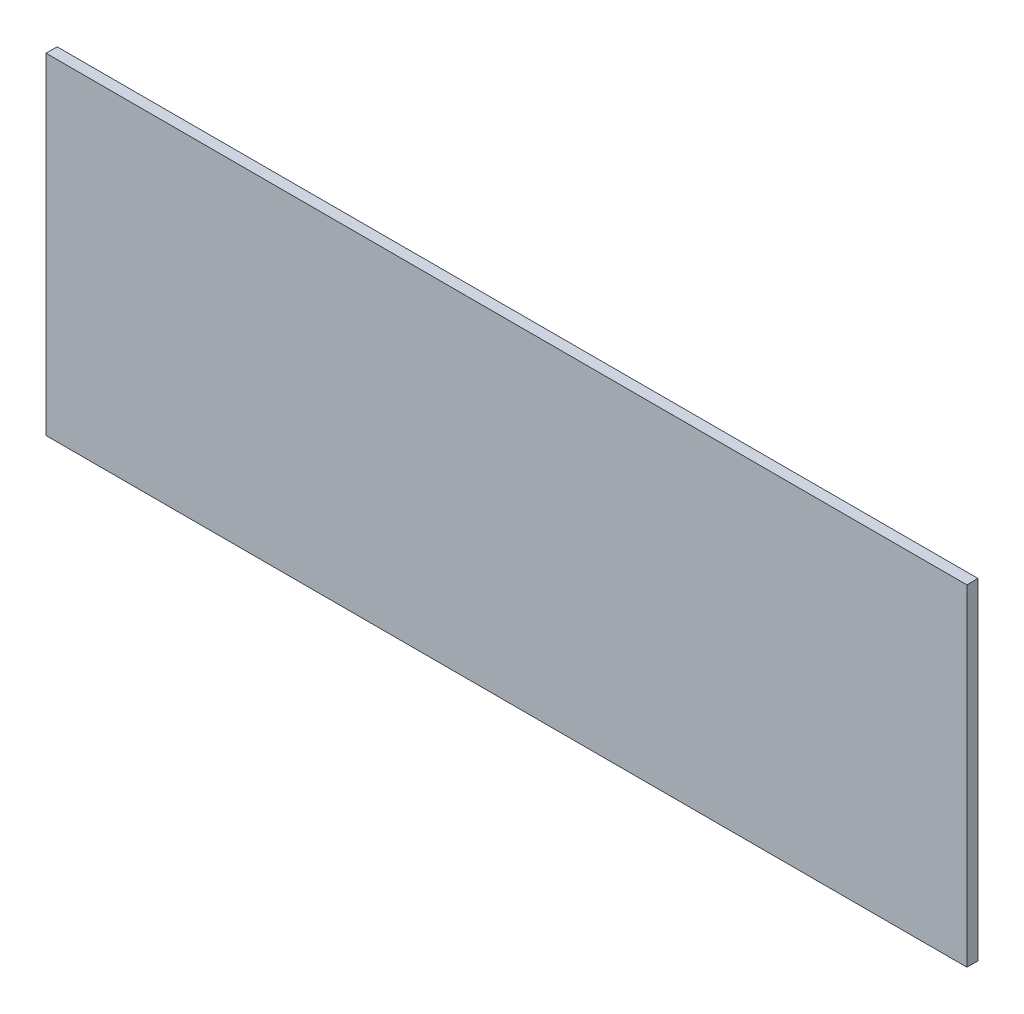
ISO-10303-21;
HEADER;
FILE_DESCRIPTION(('STEP AP214'),'2;1');
FILE_NAME('part.step','',(''),(''),'','','');
FILE_SCHEMA(('AUTOMOTIVE_DESIGN { 1 0 10303 214 1 1 1 1 }'));
ENDSEC;
DATA;
#1=APPLICATION_CONTEXT('core data for automotive mechanical design processes');
#2=APPLICATION_PROTOCOL_DEFINITION('international standard','automotive_design',2000,#1);
#3=PRODUCT_CONTEXT('',#1,'mechanical');
#4=PRODUCT('Part','Part','',(#3));
#5=PRODUCT_RELATED_PRODUCT_CATEGORY('part','',(#4));
#6=PRODUCT_DEFINITION_FORMATION('','',#4);
#7=PRODUCT_DEFINITION_CONTEXT('part definition',#1,'design');
#8=PRODUCT_DEFINITION('design','',#6,#7);
#9=PRODUCT_DEFINITION_SHAPE('','',#8);
#10=(LENGTH_UNIT() NAMED_UNIT(*) SI_UNIT(.MILLI.,.METRE.));
#11=(NAMED_UNIT(*) PLANE_ANGLE_UNIT() SI_UNIT($,.RADIAN.));
#12=(NAMED_UNIT(*) SI_UNIT($,.STERADIAN.) SOLID_ANGLE_UNIT());
#13=UNCERTAINTY_MEASURE_WITH_UNIT(LENGTH_MEASURE(1.E-05),#10,'distance_accuracy_value','');
#14=(GEOMETRIC_REPRESENTATION_CONTEXT(3) GLOBAL_UNCERTAINTY_ASSIGNED_CONTEXT((#13)) GLOBAL_UNIT_ASSIGNED_CONTEXT((#10,
#11,#12)) REPRESENTATION_CONTEXT('',''));
#15=CARTESIAN_POINT('',(0.,0.,0.));
#16=DIRECTION('',(0.,0.,1.));
#17=DIRECTION('',(1.,0.,0.));
#18=AXIS2_PLACEMENT_3D('',#15,#16,#17);
#19=CARTESIAN_POINT('',(231.775,83.34375,5.588));
#20=DIRECTION('',(-1.,0.,0.));
#21=DIRECTION('',(0.,-1.,0.));
#22=AXIS2_PLACEMENT_3D('',#19,#20,#21);
#23=PLANE('',#22);
#24=DIRECTION('',(0.,1.,0.));
#25=VECTOR('',#24,1.);
#26=CARTESIAN_POINT('',(231.775,83.34375,0.));
#27=LINE('',#26,#25);
#28=CARTESIAN_POINT('',(231.775,-83.34375,0.));
#29=VERTEX_POINT('',#28);
#30=CARTESIAN_POINT('',(231.775,83.34375,0.));
#31=VERTEX_POINT('',#30);
#32=EDGE_CURVE('E96',#29,#31,#27,.T.);
#33=ORIENTED_EDGE('',*,*,#32,.T.);
#34=DIRECTION('',(0.,0.,-1.));
#35=VECTOR('',#34,1.);
#36=CARTESIAN_POINT('',(231.775,83.34375,5.588));
#37=LINE('',#36,#35);
#38=CARTESIAN_POINT('',(231.775,83.34375,5.588));
#39=VERTEX_POINT('',#38);
#40=EDGE_CURVE('E11',#39,#31,#37,.T.);
#41=ORIENTED_EDGE('',*,*,#40,.F.);
#42=DIRECTION('',(0.,1.,0.));
#43=VECTOR('',#42,1.);
#44=CARTESIAN_POINT('',(231.775,83.34375,5.588));
#45=LINE('',#44,#43);
#46=CARTESIAN_POINT('',(231.775,-83.34375,5.588));
#47=VERTEX_POINT('',#46);
#48=EDGE_CURVE('E84',#47,#39,#45,.T.);
#49=ORIENTED_EDGE('',*,*,#48,.F.);
#50=DIRECTION('',(0.,0.,-1.));
#51=VECTOR('',#50,1.);
#52=CARTESIAN_POINT('',(231.775,-83.34375,5.588));
#53=LINE('',#52,#51);
#54=EDGE_CURVE('E92',#47,#29,#53,.T.);
#55=ORIENTED_EDGE('',*,*,#54,.T.);
#56=EDGE_LOOP('',(#33,#41,#49,#55));
#57=FACE_BOUND('',#56,.T.);
#58=ADVANCED_FACE('F33',(#57),#23,.F.);
#59=CARTESIAN_POINT('',(-231.775,83.34375,5.588));
#60=DIRECTION('',(0.,-1.,0.));
#61=DIRECTION('',(0.,0.,-1.));
#62=AXIS2_PLACEMENT_3D('',#59,#60,#61);
#63=PLANE('',#62);
#64=DIRECTION('',(-1.,0.,0.));
#65=VECTOR('',#64,1.);
#66=CARTESIAN_POINT('',(-231.775,83.34375,0.));
#67=LINE('',#66,#65);
#68=CARTESIAN_POINT('',(-231.775,83.34375,0.));
#69=VERTEX_POINT('',#68);
#70=EDGE_CURVE('E88',#31,#69,#67,.T.);
#71=ORIENTED_EDGE('',*,*,#70,.T.);
#72=DIRECTION('',(0.,0.,-1.));
#73=VECTOR('',#72,1.);
#74=CARTESIAN_POINT('',(-231.775,83.34375,5.588));
#75=LINE('',#74,#73);
#76=CARTESIAN_POINT('',(-231.775,83.34375,5.588));
#77=VERTEX_POINT('',#76);
#78=EDGE_CURVE('E41',#77,#69,#75,.T.);
#79=ORIENTED_EDGE('',*,*,#78,.F.);
#80=DIRECTION('',(-1.,0.,0.));
#81=VECTOR('',#80,1.);
#82=CARTESIAN_POINT('',(-231.775,83.34375,5.588));
#83=LINE('',#82,#81);
#84=EDGE_CURVE('E79',#39,#77,#83,.T.);
#85=ORIENTED_EDGE('',*,*,#84,.F.);
#86=ORIENTED_EDGE('',*,*,#40,.T.);
#87=EDGE_LOOP('',(#71,#79,#85,#86));
#88=FACE_BOUND('',#87,.T.);
#89=ADVANCED_FACE('F87',(#88),#63,.F.);
#90=CARTESIAN_POINT('',(-231.775,83.34375,5.588));
#91=DIRECTION('',(1.,0.,0.));
#92=DIRECTION('',(0.,1.,0.));
#93=AXIS2_PLACEMENT_3D('',#90,#91,#92);
#94=PLANE('',#93);
#95=DIRECTION('',(0.,-1.,0.));
#96=VECTOR('',#95,1.);
#97=CARTESIAN_POINT('',(-231.775,83.34375,0.));
#98=LINE('',#97,#96);
#99=CARTESIAN_POINT('',(-231.775,-83.34375,0.));
#100=VERTEX_POINT('',#99);
#101=EDGE_CURVE('E66',#69,#100,#98,.T.);
#102=ORIENTED_EDGE('',*,*,#101,.T.);
#103=DIRECTION('',(0.,0.,-1.));
#104=VECTOR('',#103,1.);
#105=CARTESIAN_POINT('',(-231.775,-83.34375,5.588));
#106=LINE('',#105,#104);
#107=CARTESIAN_POINT('',(-231.775,-83.34375,5.588));
#108=VERTEX_POINT('',#107);
#109=EDGE_CURVE('E89',#108,#100,#106,.T.);
#110=ORIENTED_EDGE('',*,*,#109,.F.);
#111=DIRECTION('',(0.,-1.,0.));
#112=VECTOR('',#111,1.);
#113=CARTESIAN_POINT('',(-231.775,83.34375,5.588));
#114=LINE('',#113,#112);
#115=EDGE_CURVE('E82',#77,#108,#114,.T.);
#116=ORIENTED_EDGE('',*,*,#115,.F.);
#117=ORIENTED_EDGE('',*,*,#78,.T.);
#118=EDGE_LOOP('',(#102,#110,#116,#117));
#119=FACE_BOUND('',#118,.T.);
#120=ADVANCED_FACE('F90',(#119),#94,.F.);
#121=CARTESIAN_POINT('',(-231.775,-83.34375,5.588));
#122=DIRECTION('',(0.,1.,0.));
#123=DIRECTION('',(0.,0.,1.));
#124=AXIS2_PLACEMENT_3D('',#121,#122,#123);
#125=PLANE('',#124);
#126=DIRECTION('',(1.,0.,0.));
#127=VECTOR('',#126,1.);
#128=CARTESIAN_POINT('',(-231.775,-83.34375,0.));
#129=LINE('',#128,#127);
#130=EDGE_CURVE('E72',#100,#29,#129,.T.);
#131=ORIENTED_EDGE('',*,*,#130,.T.);
#132=ORIENTED_EDGE('',*,*,#54,.F.);
#133=DIRECTION('',(1.,0.,0.));
#134=VECTOR('',#133,1.);
#135=CARTESIAN_POINT('',(-231.775,-83.34375,5.588));
#136=LINE('',#135,#134);
#137=EDGE_CURVE('E49',#108,#47,#136,.T.);
#138=ORIENTED_EDGE('',*,*,#137,.F.);
#139=ORIENTED_EDGE('',*,*,#109,.T.);
#140=EDGE_LOOP('',(#131,#132,#138,#139));
#141=FACE_BOUND('',#140,.T.);
#142=ADVANCED_FACE('F103',(#141),#125,.F.);
#143=CARTESIAN_POINT('',(0.,0.,5.588));
#144=DIRECTION('',(0.,0.,1.));
#145=DIRECTION('',(1.,0.,0.));
#146=AXIS2_PLACEMENT_3D('',#143,#144,#145);
#147=PLANE('',#146);
#148=ORIENTED_EDGE('',*,*,#48,.T.);
#149=ORIENTED_EDGE('',*,*,#84,.T.);
#150=ORIENTED_EDGE('',*,*,#115,.T.);
#151=ORIENTED_EDGE('',*,*,#137,.T.);
#152=EDGE_LOOP('',(#148,#149,#150,#151));
#153=FACE_BOUND('',#152,.T.);
#154=ADVANCED_FACE('F80',(#153),#147,.T.);
#155=CARTESIAN_POINT('',(0.,0.,0.));
#156=DIRECTION('',(0.,0.,1.));
#157=DIRECTION('',(1.,0.,0.));
#158=AXIS2_PLACEMENT_3D('',#155,#156,#157);
#159=PLANE('',#158);
#160=ORIENTED_EDGE('',*,*,#32,.F.);
#161=ORIENTED_EDGE('',*,*,#130,.F.);
#162=ORIENTED_EDGE('',*,*,#101,.F.);
#163=ORIENTED_EDGE('',*,*,#70,.F.);
#164=EDGE_LOOP('',(#160,#161,#162,#163));
#165=FACE_BOUND('',#164,.T.);
#166=ADVANCED_FACE('F106',(#165),#159,.F.);
#167=CLOSED_SHELL('',(#58,#89,#120,#142,#154,#166));
#168=MANIFOLD_SOLID_BREP('B2',#167);
#169=ADVANCED_BREP_SHAPE_REPRESENTATION('',(#18,#168),#14);
#170=SHAPE_DEFINITION_REPRESENTATION(#9,#169);
ENDSEC;
END-ISO-10303-21;
